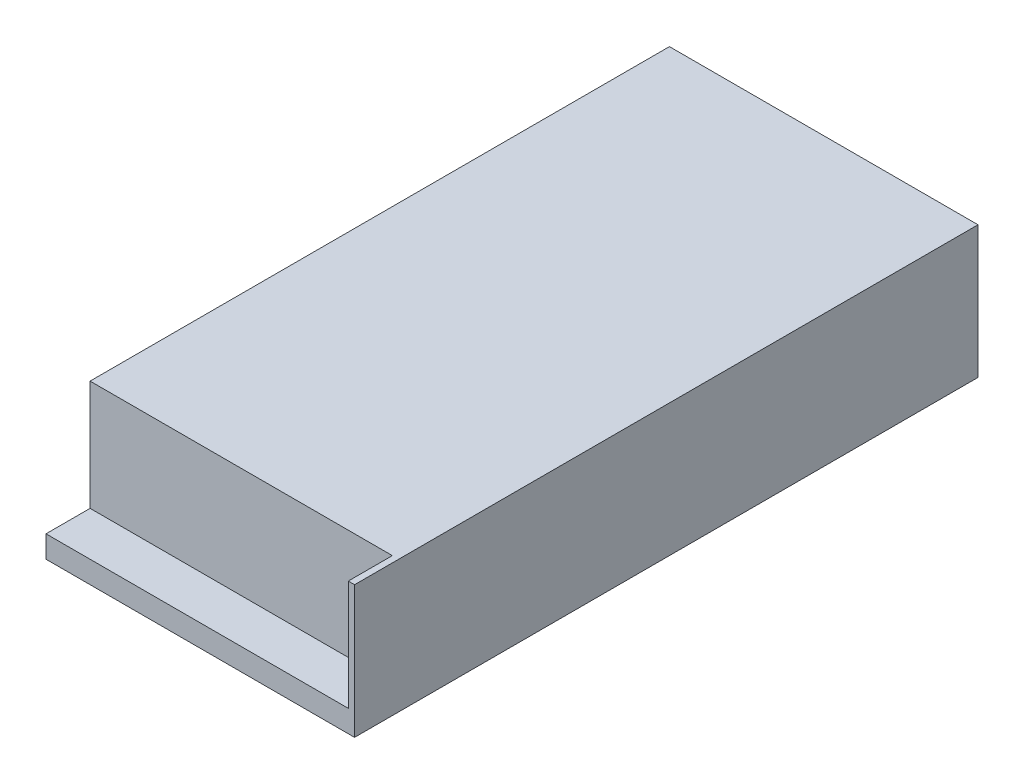
ISO-10303-21;
HEADER;
FILE_DESCRIPTION(('STEP AP214'),'2;1');
FILE_NAME('part.step','',(''),(''),'','','');
FILE_SCHEMA(('AUTOMOTIVE_DESIGN { 1 0 10303 214 1 1 1 1 }'));
ENDSEC;
DATA;
#1=APPLICATION_CONTEXT('core data for automotive mechanical design processes');
#2=APPLICATION_PROTOCOL_DEFINITION('international standard','automotive_design',2000,#1);
#3=PRODUCT_CONTEXT('',#1,'mechanical');
#4=PRODUCT('Part','Part','',(#3));
#5=PRODUCT_RELATED_PRODUCT_CATEGORY('part','',(#4));
#6=PRODUCT_DEFINITION_FORMATION('','',#4);
#7=PRODUCT_DEFINITION_CONTEXT('part definition',#1,'design');
#8=PRODUCT_DEFINITION('design','',#6,#7);
#9=PRODUCT_DEFINITION_SHAPE('','',#8);
#10=(LENGTH_UNIT() NAMED_UNIT(*) SI_UNIT(.MILLI.,.METRE.));
#11=(NAMED_UNIT(*) PLANE_ANGLE_UNIT() SI_UNIT($,.RADIAN.));
#12=(NAMED_UNIT(*) SI_UNIT($,.STERADIAN.) SOLID_ANGLE_UNIT());
#13=UNCERTAINTY_MEASURE_WITH_UNIT(LENGTH_MEASURE(1.E-05),#10,'distance_accuracy_value','');
#14=(GEOMETRIC_REPRESENTATION_CONTEXT(3) GLOBAL_UNCERTAINTY_ASSIGNED_CONTEXT((#13)) GLOBAL_UNIT_ASSIGNED_CONTEXT((#10,
#11,#12)) REPRESENTATION_CONTEXT('',''));
#15=CARTESIAN_POINT('',(0.,0.,0.));
#16=DIRECTION('',(0.,0.,1.));
#17=DIRECTION('',(1.,0.,0.));
#18=AXIS2_PLACEMENT_3D('',#15,#16,#17);
#19=CARTESIAN_POINT('',(49.,42.,99.));
#20=DIRECTION('',(-1.,0.,0.));
#21=DIRECTION('',(0.,0.,1.));
#22=AXIS2_PLACEMENT_3D('',#19,#20,#21);
#23=PLANE('',#22);
#24=DIRECTION('',(0.,0.,-1.));
#25=VECTOR('',#24,1.);
#26=CARTESIAN_POINT('',(49.,0.,99.));
#27=LINE('',#26,#25);
#28=CARTESIAN_POINT('',(49.,0.,99.));
#29=VERTEX_POINT('',#28);
#30=CARTESIAN_POINT('',(49.,0.,-99.));
#31=VERTEX_POINT('',#30);
#32=EDGE_CURVE('E134',#29,#31,#27,.T.);
#33=ORIENTED_EDGE('',*,*,#32,.T.);
#34=DIRECTION('',(0.,-1.,0.));
#35=VECTOR('',#34,1.);
#36=CARTESIAN_POINT('',(49.,42.,-99.));
#37=LINE('',#36,#35);
#38=CARTESIAN_POINT('',(49.,42.,-99.));
#39=VERTEX_POINT('',#38);
#40=EDGE_CURVE('E11',#39,#31,#37,.T.);
#41=ORIENTED_EDGE('',*,*,#40,.F.);
#42=DIRECTION('',(0.,0.,-1.));
#43=VECTOR('',#42,1.);
#44=CARTESIAN_POINT('',(49.,42.,99.));
#45=LINE('',#44,#43);
#46=CARTESIAN_POINT('',(49.,42.,99.));
#47=VERTEX_POINT('',#46);
#48=EDGE_CURVE('E130',#47,#39,#45,.T.);
#49=ORIENTED_EDGE('',*,*,#48,.F.);
#50=DIRECTION('',(0.,-1.,0.));
#51=VECTOR('',#50,1.);
#52=CARTESIAN_POINT('',(49.,42.,99.));
#53=LINE('',#52,#51);
#54=EDGE_CURVE('E125',#47,#29,#53,.T.);
#55=ORIENTED_EDGE('',*,*,#54,.T.);
#56=EDGE_LOOP('',(#33,#41,#49,#55));
#57=FACE_BOUND('',#56,.T.);
#58=ADVANCED_FACE('F36',(#57),#23,.F.);
#59=CARTESIAN_POINT('',(-49.,42.,-99.));
#60=DIRECTION('',(0.,0.,1.));
#61=DIRECTION('',(1.,0.,0.));
#62=AXIS2_PLACEMENT_3D('',#59,#60,#61);
#63=PLANE('',#62);
#64=DIRECTION('',(-1.,0.,0.));
#65=VECTOR('',#64,1.);
#66=CARTESIAN_POINT('',(-49.,0.,-99.));
#67=LINE('',#66,#65);
#68=CARTESIAN_POINT('',(-49.,0.,-99.));
#69=VERTEX_POINT('',#68);
#70=EDGE_CURVE('E132',#31,#69,#67,.T.);
#71=ORIENTED_EDGE('',*,*,#70,.T.);
#72=DIRECTION('',(0.,-1.,0.));
#73=VECTOR('',#72,1.);
#74=CARTESIAN_POINT('',(-49.,42.,-99.));
#75=LINE('',#74,#73);
#76=CARTESIAN_POINT('',(-49.,42.,-99.));
#77=VERTEX_POINT('',#76);
#78=EDGE_CURVE('E43',#77,#69,#75,.T.);
#79=ORIENTED_EDGE('',*,*,#78,.F.);
#80=DIRECTION('',(-1.,0.,0.));
#81=VECTOR('',#80,1.);
#82=CARTESIAN_POINT('',(-49.,42.,-99.));
#83=LINE('',#82,#81);
#84=EDGE_CURVE('E83',#39,#77,#83,.T.);
#85=ORIENTED_EDGE('',*,*,#84,.F.);
#86=ORIENTED_EDGE('',*,*,#40,.T.);
#87=EDGE_LOOP('',(#71,#79,#85,#86));
#88=FACE_BOUND('',#87,.T.);
#89=ADVANCED_FACE('F159',(#88),#63,.F.);
#90=CARTESIAN_POINT('',(-49.,42.,99.));
#91=DIRECTION('',(1.,0.,0.));
#92=DIRECTION('',(0.,0.,-1.));
#93=AXIS2_PLACEMENT_3D('',#90,#91,#92);
#94=PLANE('',#93);
#95=DIRECTION('',(0.,0.,1.));
#96=VECTOR('',#95,1.);
#97=CARTESIAN_POINT('',(-49.,7.,99.));
#98=LINE('',#97,#96);
#99=CARTESIAN_POINT('',(-49.,7.,85.));
#100=VERTEX_POINT('',#99);
#101=CARTESIAN_POINT('',(-49.,7.,99.));
#102=VERTEX_POINT('',#101);
#103=EDGE_CURVE('E104',#100,#102,#98,.T.);
#104=ORIENTED_EDGE('',*,*,#103,.F.);
#105=DIRECTION('',(0.,1.,0.));
#106=VECTOR('',#105,1.);
#107=CARTESIAN_POINT('',(-49.,7.,85.));
#108=LINE('',#107,#106);
#109=CARTESIAN_POINT('',(-49.,42.,85.));
#110=VERTEX_POINT('',#109);
#111=EDGE_CURVE('E137',#100,#110,#108,.T.);
#112=ORIENTED_EDGE('',*,*,#111,.T.);
#113=DIRECTION('',(0.,0.,1.));
#114=VECTOR('',#113,1.);
#115=CARTESIAN_POINT('',(-49.,42.,99.));
#116=LINE('',#115,#114);
#117=EDGE_CURVE('E139',#77,#110,#116,.T.);
#118=ORIENTED_EDGE('',*,*,#117,.F.);
#119=ORIENTED_EDGE('',*,*,#78,.T.);
#120=DIRECTION('',(0.,0.,1.));
#121=VECTOR('',#120,1.);
#122=CARTESIAN_POINT('',(-49.,0.,99.));
#123=LINE('',#122,#121);
#124=CARTESIAN_POINT('',(-49.,0.,99.));
#125=VERTEX_POINT('',#124);
#126=EDGE_CURVE('E124',#69,#125,#123,.T.);
#127=ORIENTED_EDGE('',*,*,#126,.T.);
#128=DIRECTION('',(0.,-1.,0.));
#129=VECTOR('',#128,1.);
#130=CARTESIAN_POINT('',(-49.,42.,99.));
#131=LINE('',#130,#129);
#132=EDGE_CURVE('E117',#102,#125,#131,.T.);
#133=ORIENTED_EDGE('',*,*,#132,.F.);
#134=EDGE_LOOP('',(#104,#112,#118,#119,#127,#133));
#135=FACE_BOUND('',#134,.T.);
#136=ADVANCED_FACE('F121',(#135),#94,.F.);
#137=CARTESIAN_POINT('',(-49.,42.,99.));
#138=DIRECTION('',(0.,0.,-1.));
#139=DIRECTION('',(-1.,0.,0.));
#140=AXIS2_PLACEMENT_3D('',#137,#138,#139);
#141=PLANE('',#140);
#142=DIRECTION('',(1.,0.,0.));
#143=VECTOR('',#142,1.);
#144=CARTESIAN_POINT('',(-49.,42.,99.));
#145=LINE('',#144,#143);
#146=CARTESIAN_POINT('',(47.,42.,99.));
#147=VERTEX_POINT('',#146);
#148=EDGE_CURVE('E58',#147,#47,#145,.T.);
#149=ORIENTED_EDGE('',*,*,#148,.F.);
#150=DIRECTION('',(0.,1.,0.));
#151=VECTOR('',#150,1.);
#152=CARTESIAN_POINT('',(47.,7.,99.));
#153=LINE('',#152,#151);
#154=CARTESIAN_POINT('',(47.,7.,99.));
#155=VERTEX_POINT('',#154);
#156=EDGE_CURVE('E50',#155,#147,#153,.T.);
#157=ORIENTED_EDGE('',*,*,#156,.F.);
#158=DIRECTION('',(1.,0.,0.));
#159=VECTOR('',#158,1.);
#160=CARTESIAN_POINT('',(-49.,7.,99.));
#161=LINE('',#160,#159);
#162=EDGE_CURVE('E108',#102,#155,#161,.T.);
#163=ORIENTED_EDGE('',*,*,#162,.F.);
#164=ORIENTED_EDGE('',*,*,#132,.T.);
#165=DIRECTION('',(1.,0.,0.));
#166=VECTOR('',#165,1.);
#167=CARTESIAN_POINT('',(-49.,0.,99.));
#168=LINE('',#167,#166);
#169=EDGE_CURVE('E78',#125,#29,#168,.T.);
#170=ORIENTED_EDGE('',*,*,#169,.T.);
#171=ORIENTED_EDGE('',*,*,#54,.F.);
#172=EDGE_LOOP('',(#149,#157,#163,#164,#170,#171));
#173=FACE_BOUND('',#172,.T.);
#174=ADVANCED_FACE('F116',(#173),#141,.F.);
#175=CARTESIAN_POINT('',(0.,42.,0.));
#176=DIRECTION('',(0.,-1.,0.));
#177=DIRECTION('',(0.,0.,-1.));
#178=AXIS2_PLACEMENT_3D('',#175,#176,#177);
#179=PLANE('',#178);
#180=ORIENTED_EDGE('',*,*,#117,.T.);
#181=DIRECTION('',(-1.,0.,0.));
#182=VECTOR('',#181,1.);
#183=CARTESIAN_POINT('',(-49.,42.,85.));
#184=LINE('',#183,#182);
#185=CARTESIAN_POINT('',(47.,42.,85.));
#186=VERTEX_POINT('',#185);
#187=EDGE_CURVE('E114',#186,#110,#184,.T.);
#188=ORIENTED_EDGE('',*,*,#187,.F.);
#189=DIRECTION('',(0.,0.,-1.));
#190=VECTOR('',#189,1.);
#191=CARTESIAN_POINT('',(47.,42.,99.));
#192=LINE('',#191,#190);
#193=EDGE_CURVE('E149',#147,#186,#192,.T.);
#194=ORIENTED_EDGE('',*,*,#193,.F.);
#195=ORIENTED_EDGE('',*,*,#148,.T.);
#196=ORIENTED_EDGE('',*,*,#48,.T.);
#197=ORIENTED_EDGE('',*,*,#84,.T.);
#198=EDGE_LOOP('',(#180,#188,#194,#195,#196,#197));
#199=FACE_BOUND('',#198,.T.);
#200=ADVANCED_FACE('F156',(#199),#179,.F.);
#201=CARTESIAN_POINT('',(0.,0.,0.));
#202=DIRECTION('',(0.,-1.,0.));
#203=DIRECTION('',(0.,0.,-1.));
#204=AXIS2_PLACEMENT_3D('',#201,#202,#203);
#205=PLANE('',#204);
#206=ORIENTED_EDGE('',*,*,#32,.F.);
#207=ORIENTED_EDGE('',*,*,#169,.F.);
#208=ORIENTED_EDGE('',*,*,#126,.F.);
#209=ORIENTED_EDGE('',*,*,#70,.F.);
#210=EDGE_LOOP('',(#206,#207,#208,#209));
#211=FACE_BOUND('',#210,.T.);
#212=ADVANCED_FACE('F162',(#211),#205,.T.);
#213=CARTESIAN_POINT('',(-49.,7.,85.));
#214=DIRECTION('',(0.,0.,-1.));
#215=DIRECTION('',(-1.,0.,0.));
#216=AXIS2_PLACEMENT_3D('',#213,#214,#215);
#217=PLANE('',#216);
#218=ORIENTED_EDGE('',*,*,#187,.T.);
#219=ORIENTED_EDGE('',*,*,#111,.F.);
#220=DIRECTION('',(-1.,0.,0.));
#221=VECTOR('',#220,1.);
#222=CARTESIAN_POINT('',(-49.,7.,85.));
#223=LINE('',#222,#221);
#224=CARTESIAN_POINT('',(47.,7.,85.));
#225=VERTEX_POINT('',#224);
#226=EDGE_CURVE('E110',#225,#100,#223,.T.);
#227=ORIENTED_EDGE('',*,*,#226,.F.);
#228=DIRECTION('',(0.,1.,0.));
#229=VECTOR('',#228,1.);
#230=CARTESIAN_POINT('',(47.,7.,85.));
#231=LINE('',#230,#229);
#232=EDGE_CURVE('E145',#225,#186,#231,.T.);
#233=ORIENTED_EDGE('',*,*,#232,.T.);
#234=EDGE_LOOP('',(#218,#219,#227,#233));
#235=FACE_BOUND('',#234,.T.);
#236=ADVANCED_FACE('F153',(#235),#217,.F.);
#237=CARTESIAN_POINT('',(47.,7.,99.));
#238=DIRECTION('',(1.,0.,0.));
#239=DIRECTION('',(0.,0.,-1.));
#240=AXIS2_PLACEMENT_3D('',#237,#238,#239);
#241=PLANE('',#240);
#242=ORIENTED_EDGE('',*,*,#193,.T.);
#243=ORIENTED_EDGE('',*,*,#232,.F.);
#244=DIRECTION('',(0.,0.,-1.));
#245=VECTOR('',#244,1.);
#246=CARTESIAN_POINT('',(47.,7.,99.));
#247=LINE('',#246,#245);
#248=EDGE_CURVE('E119',#155,#225,#247,.T.);
#249=ORIENTED_EDGE('',*,*,#248,.F.);
#250=ORIENTED_EDGE('',*,*,#156,.T.);
#251=EDGE_LOOP('',(#242,#243,#249,#250));
#252=FACE_BOUND('',#251,.T.);
#253=ADVANCED_FACE('F179',(#252),#241,.F.);
#254=CARTESIAN_POINT('',(0.,7.,0.));
#255=DIRECTION('',(0.,-1.,0.));
#256=DIRECTION('',(0.,0.,-1.));
#257=AXIS2_PLACEMENT_3D('',#254,#255,#256);
#258=PLANE('',#257);
#259=ORIENTED_EDGE('',*,*,#103,.T.);
#260=ORIENTED_EDGE('',*,*,#162,.T.);
#261=ORIENTED_EDGE('',*,*,#248,.T.);
#262=ORIENTED_EDGE('',*,*,#226,.T.);
#263=EDGE_LOOP('',(#259,#260,#261,#262));
#264=FACE_BOUND('',#263,.T.);
#265=ADVANCED_FACE('F106',(#264),#258,.F.);
#266=CLOSED_SHELL('',(#58,#89,#136,#174,#200,#212,#236,#253,#265));
#267=MANIFOLD_SOLID_BREP('B2',#266);
#268=ADVANCED_BREP_SHAPE_REPRESENTATION('',(#18,#267),#14);
#269=SHAPE_DEFINITION_REPRESENTATION(#9,#268);
ENDSEC;
END-ISO-10303-21;
